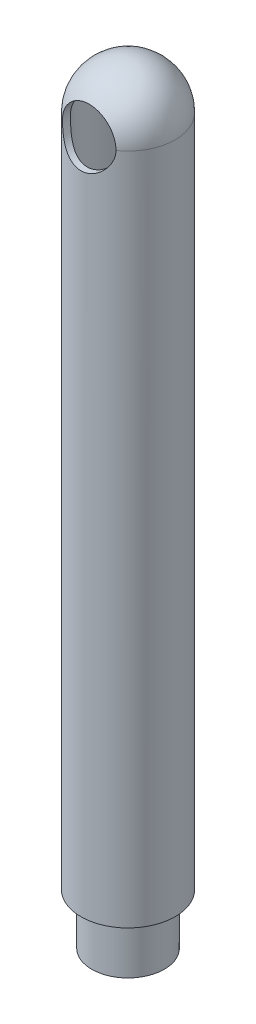
ISO-10303-21;
HEADER;
FILE_DESCRIPTION(('STEP AP214'),'2;1');
FILE_NAME('part.step','',(''),(''),'','','');
FILE_SCHEMA(('AUTOMOTIVE_DESIGN { 1 0 10303 214 1 1 1 1 }'));
ENDSEC;
DATA;
#1=APPLICATION_CONTEXT('core data for automotive mechanical design processes');
#2=APPLICATION_PROTOCOL_DEFINITION('international standard','automotive_design',2000,#1);
#3=PRODUCT_CONTEXT('',#1,'mechanical');
#4=PRODUCT('Part','Part','',(#3));
#5=PRODUCT_RELATED_PRODUCT_CATEGORY('part','',(#4));
#6=PRODUCT_DEFINITION_FORMATION('','',#4);
#7=PRODUCT_DEFINITION_CONTEXT('part definition',#1,'design');
#8=PRODUCT_DEFINITION('design','',#6,#7);
#9=PRODUCT_DEFINITION_SHAPE('','',#8);
#10=(LENGTH_UNIT() NAMED_UNIT(*) SI_UNIT(.MILLI.,.METRE.));
#11=(NAMED_UNIT(*) PLANE_ANGLE_UNIT() SI_UNIT($,.RADIAN.));
#12=(NAMED_UNIT(*) SI_UNIT($,.STERADIAN.) SOLID_ANGLE_UNIT());
#13=UNCERTAINTY_MEASURE_WITH_UNIT(LENGTH_MEASURE(1.E-05),#10,'distance_accuracy_value','');
#14=(GEOMETRIC_REPRESENTATION_CONTEXT(3) GLOBAL_UNCERTAINTY_ASSIGNED_CONTEXT((#13)) GLOBAL_UNIT_ASSIGNED_CONTEXT((#10,
#11,#12)) REPRESENTATION_CONTEXT('',''));
#15=CARTESIAN_POINT('',(0.,0.,0.));
#16=DIRECTION('',(0.,0.,1.));
#17=DIRECTION('',(1.,0.,0.));
#18=AXIS2_PLACEMENT_3D('',#15,#16,#17);
#19=CARTESIAN_POINT('',(0.,0.,0.));
#20=DIRECTION('',(0.,-1.,0.));
#21=DIRECTION('',(0.,0.,-1.));
#22=AXIS2_PLACEMENT_3D('',#19,#20,#21);
#23=CYLINDRICAL_SURFACE('',#22,37.);
#24=CARTESIAN_POINT('',(21.,568.,-30.4630924234556));
#25=CARTESIAN_POINT('',(21.0000073262817,567.731189787036,-30.4630792801586));
#26=CARTESIAN_POINT('',(20.9948387992314,567.462385228528,-30.4666501375205));
#27=CARTESIAN_POINT('',(20.9742055145974,566.925374282696,-30.4808626862339));
#28=CARTESIAN_POINT('',(20.9587413689901,566.657167860769,-30.4915039573165));
#29=CARTESIAN_POINT('',(20.9175892458381,566.122128137417,-30.5197485645538));
#30=CARTESIAN_POINT('',(20.8919096897981,565.855293887867,-30.5373461658891));
#31=CARTESIAN_POINT('',(20.8304403165183,565.323346350503,-30.5793087651143));
#32=CARTESIAN_POINT('',(20.7946504035362,565.058233079011,-30.6036738270903));
#33=CARTESIAN_POINT('',(20.6728984187858,564.270076191436,-30.6861697671083));
#34=CARTESIAN_POINT('',(20.57224222865,563.750206175432,-30.7539195489469));
#35=CARTESIAN_POINT('',(20.3330008256143,562.722932287711,-30.9126118163972));
#36=CARTESIAN_POINT('',(20.194409237282,562.215530527046,-31.00355820026));
#37=CARTESIAN_POINT('',(19.8814897424874,561.217754555845,-31.2051415253092));
#38=CARTESIAN_POINT('',(19.7072764882901,560.727331476066,-31.3157151471102));
#39=CARTESIAN_POINT('',(19.3246080672965,559.764219599621,-31.5532914305636));
#40=CARTESIAN_POINT('',(19.1161537036553,559.291530387311,-31.6802937068528));
#41=CARTESIAN_POINT('',(18.6662684755912,558.364844691443,-31.9474406108234));
#42=CARTESIAN_POINT('',(18.4247763649775,557.910885012706,-32.0876094921856));
#43=CARTESIAN_POINT('',(17.9106649403664,557.024079854279,-32.3773864757737));
#44=CARTESIAN_POINT('',(17.6380423976134,556.591236571377,-32.5269955563877));
#45=CARTESIAN_POINT('',(17.0322001145425,555.702703312134,-32.8486535677944));
#46=CARTESIAN_POINT('',(16.6956168924399,555.249551600986,-33.0213869364217));
#47=CARTESIAN_POINT('',(15.9877358756512,554.372456590684,-33.3698658898318));
#48=CARTESIAN_POINT('',(15.6164362296817,553.948514851274,-33.5456116348435));
#49=CARTESIAN_POINT('',(14.8406016882713,553.13144294136,-33.8959841445135));
#50=CARTESIAN_POINT('',(14.4360571207653,552.738321803069,-34.0706105674806));
#51=CARTESIAN_POINT('',(13.5954028480295,551.98489364322,-34.4146962655983));
#52=CARTESIAN_POINT('',(13.1592917932623,551.624588026088,-34.5841553193917));
#53=CARTESIAN_POINT('',(12.2149662427591,550.906772510843,-34.9295054327883));
#54=CARTESIAN_POINT('',(11.7038230929026,550.552677050077,-35.1045152955826));
#55=CARTESIAN_POINT('',(10.6483645388979,549.8892056197,-35.4389444159263));
#56=CARTESIAN_POINT('',(10.104046516294,549.579833186542,-35.5983624402359));
#57=CARTESIAN_POINT('',(8.9857937754531,549.009232611914,-35.8969380893811));
#58=CARTESIAN_POINT('',(8.41187673544039,548.747976149483,-36.0361076222407));
#59=CARTESIAN_POINT('',(7.23818631111357,548.276704394683,-36.2900669392296));
#60=CARTESIAN_POINT('',(6.63841665456105,548.066681743657,-36.4048602241858));
#61=CARTESIAN_POINT('',(5.47135075111755,547.71694561731,-36.597581122399));
#62=CARTESIAN_POINT('',(4.90580182372328,547.572689577531,-36.677854844609));
#63=CARTESIAN_POINT('',(3.7616967872567,547.331392524959,-36.8127871980505));
#64=CARTESIAN_POINT('',(3.18314137290279,547.234348996633,-36.8674471940032));
#65=CARTESIAN_POINT('',(2.01841377857129,547.088992978192,-36.9495144350707));
#66=CARTESIAN_POINT('',(1.43224700389415,547.040647636648,-36.9769400521156));
#67=CARTESIAN_POINT('',(0.25730311423253,546.993349213026,-37.0037697337288));
#68=CARTESIAN_POINT('',(-0.331473770466394,546.994391856963,-37.0031762230435));
#69=CARTESIAN_POINT('',(-1.44061185769002,547.042958368936,-36.9756312419025));
#70=CARTESIAN_POINT('',(-1.96128382139083,547.085288278257,-36.9516251211814));
#71=CARTESIAN_POINT('',(-2.99657110881481,547.208361192122,-36.8821048028966));
#72=CARTESIAN_POINT('',(-3.51118698314675,547.289100676451,-36.8365925763571));
#73=CARTESIAN_POINT('',(-4.53086126258383,547.488023877407,-36.7251193400592));
#74=CARTESIAN_POINT('',(-5.03591945263197,547.606208435524,-36.6591578707523));
#75=CARTESIAN_POINT('',(-6.03328875863972,547.878700183883,-36.5082708771462));
#76=CARTESIAN_POINT('',(-6.52559936712548,548.033008809755,-36.4233445991601));
#77=CARTESIAN_POINT('',(-7.49908773107979,548.377748025534,-36.2355032633964));
#78=CARTESIAN_POINT('',(-7.98012218348488,548.568496575861,-36.1324305390903));
#79=CARTESIAN_POINT('',(-8.9238646826361,548.98341858198,-35.9109954485033));
#80=CARTESIAN_POINT('',(-9.386572841195,549.207591833801,-35.7926331755261));
#81=CARTESIAN_POINT('',(-10.2916859365514,549.687608860885,-35.542954937893));
#82=CARTESIAN_POINT('',(-10.734087584937,549.943457741032,-35.4116368859617));
#83=CARTESIAN_POINT('',(-11.5968272743117,550.48506152568,-35.1385597229849));
#84=CARTESIAN_POINT('',(-12.0171631762838,550.770819321493,-34.9967996028916));
#85=CARTESIAN_POINT('',(-12.8800999131459,551.404197106812,-34.6891289968841));
#86=CARTESIAN_POINT('',(-13.319919062455,551.75516103625,-34.5222921909058));
#87=CARTESIAN_POINT('',(-14.1687439274886,552.489943167464,-34.1826814793623));
#88=CARTESIAN_POINT('',(-14.5777475745786,552.873763571196,-34.0099071763464));
#89=CARTESIAN_POINT('',(-15.3638750751635,553.672896489012,-33.6620902331708));
#90=CARTESIAN_POINT('',(-15.7409568816733,554.088249212754,-33.4870449410201));
#91=CARTESIAN_POINT('',(-16.4610901684504,554.948290961332,-33.1389872520046));
#92=CARTESIAN_POINT('',(-16.8041404078302,555.392981054908,-32.9659749294702));
#93=CARTESIAN_POINT('',(-17.4865452454603,556.355175145804,-32.6095553743422));
#94=CARTESIAN_POINT('',(-17.8222207618946,556.875539564525,-32.4267984344191));
#95=CARTESIAN_POINT('',(-18.4480855648418,557.947471061146,-32.0748672727312));
#96=CARTESIAN_POINT('',(-18.7382679531771,558.499042853835,-31.9056951127363));
#97=CARTESIAN_POINT('',(-19.2695439844222,559.629017273637,-31.5876606985385));
#98=CARTESIAN_POINT('',(-19.5107722206612,560.207340815678,-31.4387431395766));
#99=CARTESIAN_POINT('',(-19.9420266180382,561.388608918112,-31.1669807495764));
#100=CARTESIAN_POINT('',(-20.1320732349065,561.991543530929,-31.0441255064065));
#101=CARTESIAN_POINT('',(-20.410527615124,563.03888707221,-30.8614542643029));
#102=CARTESIAN_POINT('',(-20.5124191216094,563.478373609711,-30.7936971856277));
#103=CARTESIAN_POINT('',(-20.68797974885,564.36520971563,-30.6760281519441));
#104=CARTESIAN_POINT('',(-20.7616572270046,564.812556914481,-30.6261109128122));
#105=CARTESIAN_POINT('',(-20.8802981419357,565.71500696322,-30.5453493737808));
#106=CARTESIAN_POINT('',(-20.9251225969,566.170136669308,-30.5145974131522));
#107=CARTESIAN_POINT('',(-20.9700148561181,566.855039339858,-30.4837458401841));
#108=CARTESIAN_POINT('',(-20.9812548926054,567.083805043495,-30.4760080073256));
#109=CARTESIAN_POINT('',(-20.9962483577068,567.541705643966,-30.4656790457651));
#110=CARTESIAN_POINT('',(-21.0000015200158,567.770840553642,-30.4630881001358));
#111=CARTESIAN_POINT('',(-21.,568.,-30.4630924234556));
#112=B_SPLINE_CURVE_WITH_KNOTS('',3,(#24,#25,#26,#27,#28,#29,#30,#31,#32,#33,#34,#35,#36,#37,
#38,#39,#40,#41,#42,#43,#44,#45,#46,#47,#48,#49,#50,#51,#52,#53,#54,#55,#56,#57,#58,#59,#60,#61,
#62,#63,#64,#65,#66,#67,#68,#69,#70,#71,#72,#73,#74,#75,#76,#77,#78,#79,#80,#81,#82,#83,#84,#85,
#86,#87,#88,#89,#90,#91,#92,#93,#94,#95,#96,#97,#98,#99,#100,#101,#102,#103,#104,#105,#106,#107,
#108,#109,#110,#111),.UNSPECIFIED.,.F.,.F.,(4,2,2,2,2,2,2,2,2,2,2,2,2,2,2,2,2,2,2,2,2,2,2,2,2,2,
2,2,2,2,2,2,2,2,2,2,2,2,2,2,2,2,2,4),(0.,0.806347326984684,1.61264672857906,2.418282796196,
3.22392649323257,4.82317636415643,6.42269517060289,8.01714457517711,9.61155658588832,
11.208965453795,12.8065401509339,14.5756774360223,16.3449091157491,18.1146573591833,
19.8844813080264,21.8198633708128,23.7553983894601,25.6897904895691,27.62390459124,
29.3888702881488,31.1537419354884,32.9174222147473,34.680949867203,36.2479068613803,
37.8147202725472,39.3815688966908,40.9484798005702,42.5297450477564,44.1110006458084,
45.6925114135557,47.2741752083181,49.033043957547,50.7920306740511,52.5532993764,
54.3146322760145,56.2491275598298,58.1839158903698,60.1133104598841,62.0419327610579,
63.4093634765838,64.7763888256382,66.1499506600343,66.837310691859,67.524695172365),.UNSPECIFIED.);
#113=CARTESIAN_POINT('',(21.,568.,-30.4630924234556));
#114=VERTEX_POINT('',#113);
#115=CARTESIAN_POINT('',(-21.,568.,-30.4630924234556));
#116=VERTEX_POINT('',#115);
#117=EDGE_CURVE('E54',#114,#116,#112,.T.);
#118=ORIENTED_EDGE('',*,*,#117,.F.);
#119=CARTESIAN_POINT('',(0.,568.,0.));
#120=DIRECTION('',(0.,-1.,0.));
#121=DIRECTION('',(0.,0.,-1.));
#122=AXIS2_PLACEMENT_3D('',#119,#120,#121);
#123=CIRCLE('',#122,37.);
#124=CARTESIAN_POINT('',(21.,568.,30.4630924234556));
#125=VERTEX_POINT('',#124);
#126=EDGE_CURVE('E87',#114,#125,#123,.T.);
#127=ORIENTED_EDGE('',*,*,#126,.T.);
#128=CARTESIAN_POINT('',(-21.,568.,30.4630924234556));
#129=CARTESIAN_POINT('',(-21.0000073262817,567.731189787036,30.4630792801586));
#130=CARTESIAN_POINT('',(-20.9948387992314,567.462385228528,30.4666501375205));
#131=CARTESIAN_POINT('',(-20.9742055145974,566.925374282696,30.4808626862339));
#132=CARTESIAN_POINT('',(-20.9587413689901,566.657167860769,30.4915039573165));
#133=CARTESIAN_POINT('',(-20.9175892458381,566.122128137417,30.5197485645538));
#134=CARTESIAN_POINT('',(-20.8919096897981,565.855293887867,30.5373461658891));
#135=CARTESIAN_POINT('',(-20.8304403165183,565.323346350503,30.5793087651143));
#136=CARTESIAN_POINT('',(-20.7946504035362,565.058233079011,30.6036738270903));
#137=CARTESIAN_POINT('',(-20.6728984187858,564.270076191436,30.6861697671083));
#138=CARTESIAN_POINT('',(-20.57224222865,563.750206175432,30.7539195489469));
#139=CARTESIAN_POINT('',(-20.3330008256143,562.722932287711,30.9126118163972));
#140=CARTESIAN_POINT('',(-20.194409237282,562.215530527046,31.00355820026));
#141=CARTESIAN_POINT('',(-19.8814897424874,561.217754555845,31.2051415253092));
#142=CARTESIAN_POINT('',(-19.7072764882901,560.727331476066,31.3157151471102));
#143=CARTESIAN_POINT('',(-19.3246080672965,559.764219599621,31.5532914305636));
#144=CARTESIAN_POINT('',(-19.1161537036553,559.291530387311,31.6802937068528));
#145=CARTESIAN_POINT('',(-18.6662684755912,558.364844691443,31.9474406108234));
#146=CARTESIAN_POINT('',(-18.4247763649775,557.910885012706,32.0876094921856));
#147=CARTESIAN_POINT('',(-17.9106649403664,557.024079854279,32.3773864757737));
#148=CARTESIAN_POINT('',(-17.6380423976134,556.591236571377,32.5269955563877));
#149=CARTESIAN_POINT('',(-17.0322001145425,555.702703312134,32.8486535677944));
#150=CARTESIAN_POINT('',(-16.6956168924399,555.249551600986,33.0213869364217));
#151=CARTESIAN_POINT('',(-15.9877358756512,554.372456590684,33.3698658898318));
#152=CARTESIAN_POINT('',(-15.6164362296817,553.948514851274,33.5456116348435));
#153=CARTESIAN_POINT('',(-14.8406016882713,553.13144294136,33.8959841445135));
#154=CARTESIAN_POINT('',(-14.4360571207653,552.738321803069,34.0706105674806));
#155=CARTESIAN_POINT('',(-13.5954028480295,551.98489364322,34.4146962655983));
#156=CARTESIAN_POINT('',(-13.1592917932623,551.624588026088,34.5841553193917));
#157=CARTESIAN_POINT('',(-12.2149662427591,550.906772510843,34.9295054327883));
#158=CARTESIAN_POINT('',(-11.7038230929026,550.552677050077,35.1045152955826));
#159=CARTESIAN_POINT('',(-10.6483645388979,549.8892056197,35.4389444159263));
#160=CARTESIAN_POINT('',(-10.104046516294,549.579833186542,35.5983624402359));
#161=CARTESIAN_POINT('',(-8.9857937754531,549.009232611914,35.8969380893811));
#162=CARTESIAN_POINT('',(-8.41187673544039,548.747976149483,36.0361076222407));
#163=CARTESIAN_POINT('',(-7.23818631111357,548.276704394683,36.2900669392296));
#164=CARTESIAN_POINT('',(-6.63841665456105,548.066681743657,36.4048602241858));
#165=CARTESIAN_POINT('',(-5.47135075111755,547.71694561731,36.597581122399));
#166=CARTESIAN_POINT('',(-4.90580182372328,547.572689577531,36.677854844609));
#167=CARTESIAN_POINT('',(-3.7616967872567,547.331392524959,36.8127871980505));
#168=CARTESIAN_POINT('',(-3.18314137290279,547.234348996633,36.8674471940032));
#169=CARTESIAN_POINT('',(-2.01841377857129,547.088992978192,36.9495144350707));
#170=CARTESIAN_POINT('',(-1.43224700389415,547.040647636648,36.9769400521156));
#171=CARTESIAN_POINT('',(-0.25730311423253,546.993349213026,37.0037697337288));
#172=CARTESIAN_POINT('',(0.331473770466394,546.994391856963,37.0031762230435));
#173=CARTESIAN_POINT('',(1.44061185769002,547.042958368936,36.9756312419025));
#174=CARTESIAN_POINT('',(1.96128382139083,547.085288278257,36.9516251211814));
#175=CARTESIAN_POINT('',(2.99657110881481,547.208361192122,36.8821048028966));
#176=CARTESIAN_POINT('',(3.51118698314675,547.289100676451,36.8365925763571));
#177=CARTESIAN_POINT('',(4.53086126258383,547.488023877407,36.7251193400592));
#178=CARTESIAN_POINT('',(5.03591945263197,547.606208435524,36.6591578707523));
#179=CARTESIAN_POINT('',(6.03328875863972,547.878700183883,36.5082708771462));
#180=CARTESIAN_POINT('',(6.52559936712548,548.033008809755,36.4233445991601));
#181=CARTESIAN_POINT('',(7.49908773107979,548.377748025534,36.2355032633964));
#182=CARTESIAN_POINT('',(7.98012218348488,548.568496575861,36.1324305390903));
#183=CARTESIAN_POINT('',(8.9238646826361,548.98341858198,35.9109954485033));
#184=CARTESIAN_POINT('',(9.386572841195,549.207591833801,35.7926331755261));
#185=CARTESIAN_POINT('',(10.2916859365514,549.687608860885,35.542954937893));
#186=CARTESIAN_POINT('',(10.734087584937,549.943457741032,35.4116368859617));
#187=CARTESIAN_POINT('',(11.5968272743117,550.48506152568,35.1385597229849));
#188=CARTESIAN_POINT('',(12.0171631762838,550.770819321493,34.9967996028916));
#189=CARTESIAN_POINT('',(12.8800999131459,551.404197106812,34.6891289968841));
#190=CARTESIAN_POINT('',(13.319919062455,551.75516103625,34.5222921909058));
#191=CARTESIAN_POINT('',(14.1687439274886,552.489943167464,34.1826814793623));
#192=CARTESIAN_POINT('',(14.5777475745786,552.873763571196,34.0099071763464));
#193=CARTESIAN_POINT('',(15.3638750751635,553.672896489012,33.6620902331708));
#194=CARTESIAN_POINT('',(15.7409568816733,554.088249212754,33.4870449410201));
#195=CARTESIAN_POINT('',(16.4610901684504,554.948290961332,33.1389872520046));
#196=CARTESIAN_POINT('',(16.8041404078302,555.392981054908,32.9659749294702));
#197=CARTESIAN_POINT('',(17.4865452454603,556.355175145804,32.6095553743422));
#198=CARTESIAN_POINT('',(17.8222207618946,556.875539564525,32.4267984344191));
#199=CARTESIAN_POINT('',(18.4480855648418,557.947471061146,32.0748672727312));
#200=CARTESIAN_POINT('',(18.7382679531771,558.499042853835,31.9056951127363));
#201=CARTESIAN_POINT('',(19.2695439844222,559.629017273637,31.5876606985385));
#202=CARTESIAN_POINT('',(19.5107722206612,560.207340815678,31.4387431395766));
#203=CARTESIAN_POINT('',(19.9420266180382,561.388608918112,31.1669807495764));
#204=CARTESIAN_POINT('',(20.1320732349065,561.991543530929,31.0441255064065));
#205=CARTESIAN_POINT('',(20.410527615124,563.03888707221,30.8614542643029));
#206=CARTESIAN_POINT('',(20.5124191216094,563.478373609711,30.7936971856277));
#207=CARTESIAN_POINT('',(20.68797974885,564.36520971563,30.6760281519441));
#208=CARTESIAN_POINT('',(20.7616572270046,564.812556914481,30.6261109128122));
#209=CARTESIAN_POINT('',(20.8802981419357,565.71500696322,30.5453493737808));
#210=CARTESIAN_POINT('',(20.9251225969,566.170136669308,30.5145974131522));
#211=CARTESIAN_POINT('',(20.9700148561181,566.855039339858,30.4837458401841));
#212=CARTESIAN_POINT('',(20.9812548926054,567.083805043495,30.4760080073256));
#213=CARTESIAN_POINT('',(20.9962483577068,567.541705643966,30.4656790457651));
#214=CARTESIAN_POINT('',(21.0000015200158,567.770840553642,30.4630881001358));
#215=CARTESIAN_POINT('',(21.,568.,30.4630924234556));
#216=B_SPLINE_CURVE_WITH_KNOTS('',3,(#128,#129,#130,#131,#132,#133,#134,#135,#136,#137,#138,
#139,#140,#141,#142,#143,#144,#145,#146,#147,#148,#149,#150,#151,#152,#153,#154,#155,#156,#157,
#158,#159,#160,#161,#162,#163,#164,#165,#166,#167,#168,#169,#170,#171,#172,#173,#174,#175,#176,
#177,#178,#179,#180,#181,#182,#183,#184,#185,#186,#187,#188,#189,#190,#191,#192,#193,#194,#195,
#196,#197,#198,#199,#200,#201,#202,#203,#204,#205,#206,#207,#208,#209,#210,#211,#212,#213,#214,
#215),.UNSPECIFIED.,.F.,.F.,(4,2,2,2,2,2,2,2,2,2,2,2,2,2,2,2,2,2,2,2,2,2,2,2,2,2,2,2,2,2,2,2,2,
2,2,2,2,2,2,2,2,2,2,4),(0.,0.806347326984684,1.61264672857906,2.418282796196,3.22392649323257,
4.82317636415643,6.42269517060289,8.01714457517711,9.61155658588832,11.208965453795,
12.8065401509339,14.5756774360223,16.3449091157491,18.1146573591833,19.8844813080264,
21.8198633708128,23.7553983894601,25.6897904895691,27.62390459124,29.3888702881488,
31.1537419354884,32.9174222147473,34.680949867203,36.2479068613803,37.8147202725472,
39.3815688966908,40.9484798005702,42.5297450477564,44.1110006458084,45.6925114135557,
47.2741752083181,49.033043957547,50.7920306740511,52.5532993764,54.3146322760145,
56.2491275598298,58.1839158903698,60.1133104598841,62.0419327610579,63.4093634765838,
64.7763888256382,66.1499506600343,66.837310691859,67.524695172365),.UNSPECIFIED.);
#217=CARTESIAN_POINT('',(-21.,568.,30.4630924234556));
#218=VERTEX_POINT('',#217);
#219=EDGE_CURVE('E61',#218,#125,#216,.T.);
#220=ORIENTED_EDGE('',*,*,#219,.F.);
#221=EDGE_CURVE('E100',#218,#116,#123,.T.);
#222=ORIENTED_EDGE('',*,*,#221,.T.);
#223=EDGE_LOOP('',(#118,#127,#220,#222));
#224=FACE_BOUND('',#223,.T.);
#225=CARTESIAN_POINT('',(0.,40.,0.));
#226=DIRECTION('',(0.,-1.,0.));
#227=DIRECTION('',(0.,0.,-1.));
#228=AXIS2_PLACEMENT_3D('',#225,#226,#227);
#229=CIRCLE('',#228,37.);
#230=CARTESIAN_POINT('',(0.,40.,-37.));
#231=VERTEX_POINT('',#230);
#232=EDGE_CURVE('E136',#231,#231,#229,.T.);
#233=ORIENTED_EDGE('',*,*,#232,.F.);
#234=EDGE_LOOP('',(#233));
#235=FACE_BOUND('',#234,.T.);
#236=ADVANCED_FACE('F35',(#224,#235),#23,.T.);
#237=CARTESIAN_POINT('',(0.,568.,0.));
#238=DIRECTION('',(0.,-1.,0.));
#239=DIRECTION('',(1.,0.,0.));
#240=AXIS2_PLACEMENT_3D('',#237,#238,#239);
#241=SPHERICAL_SURFACE('',#240,37.);
#242=CARTESIAN_POINT('',(0.,568.,30.4630924234556));
#243=DIRECTION('',(0.,0.,-1.));
#244=DIRECTION('',(-1.,0.,0.));
#245=AXIS2_PLACEMENT_3D('',#242,#243,#244);
#246=CIRCLE('',#245,21.);
#247=EDGE_CURVE('E129',#125,#218,#246,.F.);
#248=ORIENTED_EDGE('',*,*,#247,.F.);
#249=ORIENTED_EDGE('',*,*,#126,.F.);
#250=CARTESIAN_POINT('',(0.,568.,-30.4630924234556));
#251=DIRECTION('',(0.,0.,1.));
#252=DIRECTION('',(1.,0.,0.));
#253=AXIS2_PLACEMENT_3D('',#250,#251,#252);
#254=CIRCLE('',#253,21.);
#255=EDGE_CURVE('E130',#116,#114,#254,.F.);
#256=ORIENTED_EDGE('',*,*,#255,.F.);
#257=ORIENTED_EDGE('',*,*,#221,.F.);
#258=EDGE_LOOP('',(#248,#249,#256,#257));
#259=FACE_BOUND('',#258,.T.);
#260=ADVANCED_FACE('F172',(#259),#241,.T.);
#261=CARTESIAN_POINT('',(0.,568.,0.));
#262=DIRECTION('',(0.,-1.,0.));
#263=DIRECTION('',(1.,0.,0.));
#264=AXIS2_PLACEMENT_3D('',#261,#262,#263);
#265=SPHERICAL_SURFACE('',#264,32.);
#266=CARTESIAN_POINT('',(0.,568.,0.));
#267=DIRECTION('',(0.,-1.,0.));
#268=DIRECTION('',(0.,0.,-1.));
#269=AXIS2_PLACEMENT_3D('',#266,#267,#268);
#270=CIRCLE('',#269,32.);
#271=CARTESIAN_POINT('',(21.,568.,-24.1453929352993));
#272=VERTEX_POINT('',#271);
#273=CARTESIAN_POINT('',(21.,568.,24.1453929352993));
#274=VERTEX_POINT('',#273);
#275=EDGE_CURVE('E93',#272,#274,#270,.T.);
#276=ORIENTED_EDGE('',*,*,#275,.T.);
#277=CARTESIAN_POINT('',(0.,568.,24.1453929352993));
#278=DIRECTION('',(0.,0.,-1.));
#279=DIRECTION('',(-1.,0.,0.));
#280=AXIS2_PLACEMENT_3D('',#277,#278,#279);
#281=CIRCLE('',#280,21.);
#282=CARTESIAN_POINT('',(-21.,568.,24.1453929352993));
#283=VERTEX_POINT('',#282);
#284=EDGE_CURVE('E82',#274,#283,#281,.F.);
#285=ORIENTED_EDGE('',*,*,#284,.T.);
#286=CARTESIAN_POINT('',(-21.,568.,-24.1453929352993));
#287=VERTEX_POINT('',#286);
#288=EDGE_CURVE('E92',#283,#287,#270,.T.);
#289=ORIENTED_EDGE('',*,*,#288,.T.);
#290=CARTESIAN_POINT('',(0.,568.,-24.1453929352993));
#291=DIRECTION('',(0.,0.,1.));
#292=DIRECTION('',(1.,0.,0.));
#293=AXIS2_PLACEMENT_3D('',#290,#291,#292);
#294=CIRCLE('',#293,21.);
#295=EDGE_CURVE('E94',#287,#272,#294,.F.);
#296=ORIENTED_EDGE('',*,*,#295,.T.);
#297=EDGE_LOOP('',(#276,#285,#289,#296));
#298=FACE_BOUND('',#297,.T.);
#299=ADVANCED_FACE('F90',(#298),#265,.F.);
#300=CARTESIAN_POINT('',(0.,0.,0.));
#301=DIRECTION('',(0.,-1.,0.));
#302=DIRECTION('',(0.,0.,-1.));
#303=AXIS2_PLACEMENT_3D('',#300,#301,#302);
#304=CYLINDRICAL_SURFACE('',#303,32.);
#305=ORIENTED_EDGE('',*,*,#275,.F.);
#306=CARTESIAN_POINT('',(21.,568.,-24.1453929352993));
#307=CARTESIAN_POINT('',(21.0000088316979,567.740691037745,-24.1453747677393));
#308=CARTESIAN_POINT('',(20.9951972765071,567.481389489406,-24.1495697541191));
#309=CARTESIAN_POINT('',(20.9760002226579,566.963431901864,-24.1662514695807));
#310=CARTESIAN_POINT('',(20.9616156272982,566.704775804069,-24.1787374163389));
#311=CARTESIAN_POINT('',(20.9233631858055,566.189012695057,-24.2118458608544));
#312=CARTESIAN_POINT('',(20.8995071977962,565.931904153378,-24.2324581842149));
#313=CARTESIAN_POINT('',(20.8424448952335,565.41950084767,-24.2815545901595));
#314=CARTESIAN_POINT('',(20.8092384326426,565.164206112423,-24.3100387973717));
#315=CARTESIAN_POINT('',(20.6965472767031,564.406718763127,-24.4062037181729));
#316=CARTESIAN_POINT('',(20.603607348189,563.907831391839,-24.484935518309));
#317=CARTESIAN_POINT('',(20.383230871151,562.922703361117,-24.6686919441093));
#318=CARTESIAN_POINT('',(20.255784861515,562.436466210343,-24.7737237803018));
#319=CARTESIAN_POINT('',(19.9689375471104,561.481658382307,-25.0055059082618));
#320=CARTESIAN_POINT('',(19.8096982360572,561.013011902402,-25.1321456458305));
#321=CARTESIAN_POINT('',(19.4606530644217,560.092710379754,-25.4033815484109));
#322=CARTESIAN_POINT('',(19.2708486384692,559.641054540749,-25.5479768705714));
#323=CARTESIAN_POINT('',(18.8617380553961,558.754802944317,-25.8514962040515));
#324=CARTESIAN_POINT('',(18.6423570553214,558.320254202795,-26.0104562170485));
#325=CARTESIAN_POINT('',(18.1758299736148,557.470314733637,-26.3385753299218));
#326=CARTESIAN_POINT('',(17.9286803038417,557.054926491637,-26.5077357465364));
#327=CARTESIAN_POINT('',(17.3689891030261,556.183709731309,-26.8783737219659));
#328=CARTESIAN_POINT('',(17.052189822581,555.731064150408,-27.080913932151));
#329=CARTESIAN_POINT('',(16.3848883436248,554.853157212833,-27.4897906969876));
#330=CARTESIAN_POINT('',(16.0343839514128,554.427897641593,-27.6961274980328));
#331=CARTESIAN_POINT('',(15.3007230709074,553.605853630457,-28.1080933809534));
#332=CARTESIAN_POINT('',(14.9175553028036,553.209079115301,-28.3137221926224));
#333=CARTESIAN_POINT('',(14.1197500789186,552.445659373694,-28.7199073269651));
#334=CARTESIAN_POINT('',(13.705110563228,552.079016122691,-28.9204633164617));
#335=CARTESIAN_POINT('',(12.7858306114702,551.329022586695,-29.3395942097164));
#336=CARTESIAN_POINT('',(12.2766837938949,550.950408540102,-29.5568100432697));
#337=CARTESIAN_POINT('',(11.2210442373302,550.237858130975,-29.9734912945481));
#338=CARTESIAN_POINT('',(10.6745471763521,549.903926952195,-30.1729546518738));
#339=CARTESIAN_POINT('',(9.54741372521585,549.284766391966,-30.5483126085786));
#340=CARTESIAN_POINT('',(8.96680261086228,548.999501549402,-30.7242243487406));
#341=CARTESIAN_POINT('',(7.77493832830598,548.481488722636,-31.0472424497318));
#342=CARTESIAN_POINT('',(7.16369149881972,548.248729928985,-31.1943547386924));
#343=CARTESIAN_POINT('',(5.98400123885732,547.862132043321,-31.4406436445465));
#344=CARTESIAN_POINT('',(5.4182012054441,547.702441660689,-31.5433055403064));
#345=CARTESIAN_POINT('',(4.2707936170599,547.430415310377,-31.7190322235755));
#346=CARTESIAN_POINT('',(3.68918710819912,547.31807621696,-31.7920989646969));
#347=CARTESIAN_POINT('',(2.51606531754386,547.142847689961,-31.9063691696717));
#348=CARTESIAN_POINT('',(1.92456061227871,547.079908536209,-31.9476046704178));
#349=CARTESIAN_POINT('',(0.7369953107896,547.004508202843,-31.9970285689199));
#350=CARTESIAN_POINT('',(0.14093533637272,546.992040252855,-32.0052213991287));
#351=CARTESIAN_POINT('',(-0.961567175425778,547.01588625848,-31.9895769030265));
#352=CARTESIAN_POINT('',(-1.46824295696805,547.045267102885,-31.9702917121716));
#353=CARTESIAN_POINT('',(-2.47664429448446,547.140406828278,-31.9080134046263));
#354=CARTESIAN_POINT('',(-2.97837046012765,547.206161170547,-31.8650232458663));
#355=CARTESIAN_POINT('',(-3.97337860741308,547.373153357857,-31.756303248893));
#356=CARTESIAN_POINT('',(-4.46666012877828,547.474393130621,-31.6905721752968));
#357=CARTESIAN_POINT('',(-5.44157414604317,547.711064196975,-31.5377987791912));
#358=CARTESIAN_POINT('',(-5.92320613966883,547.84649696194,-31.4507555395927));
#359=CARTESIAN_POINT('',(-6.87094197136687,548.149631034804,-31.257376111375));
#360=CARTESIAN_POINT('',(-7.33707852742386,548.317258516305,-31.1510840937894));
#361=CARTESIAN_POINT('',(-8.25265227363694,548.683250544071,-30.9211342776345));
#362=CARTESIAN_POINT('',(-8.70208973558279,548.881614589803,-30.7974767618578));
#363=CARTESIAN_POINT('',(-9.58238329813768,549.307301771889,-30.5350435362887));
#364=CARTESIAN_POINT('',(-10.013240417395,549.534623317969,-30.3962686567649));
#365=CARTESIAN_POINT('',(-10.8549575374055,550.016531513341,-30.1059487747669));
#366=CARTESIAN_POINT('',(-11.2658152203511,550.271121311959,-29.9544022976783));
#367=CARTESIAN_POINT('',(-12.1182215278016,550.840618256934,-29.6206757017217));
#368=CARTESIAN_POINT('',(-12.5568486936885,551.159066537129,-29.4370706534333));
#369=CARTESIAN_POINT('',(-13.405734382334,551.826629289831,-29.0603162969956));
#370=CARTESIAN_POINT('',(-13.815990880721,552.175745946633,-28.8671663094557));
#371=CARTESIAN_POINT('',(-14.6077999759704,552.903579506988,-28.4746867647341));
#372=CARTESIAN_POINT('',(-14.9892960107424,553.282351898377,-28.2753460659012));
#373=CARTESIAN_POINT('',(-15.7217174653375,554.06745349012,-27.874753233038));
#374=CARTESIAN_POINT('',(-16.0726409813813,554.473784403772,-27.6735009808377));
#375=CARTESIAN_POINT('',(-16.7933004623472,555.375949408215,-27.2431023121571));
#376=CARTESIAN_POINT('',(-17.1579263128651,555.876052917794,-27.014313558808));
#377=CARTESIAN_POINT('',(-17.8434627758509,556.909667815585,-26.5664923504611));
#378=CARTESIAN_POINT('',(-18.1643662674574,557.443184625065,-26.3474614885868));
#379=CARTESIAN_POINT('',(-18.7588133044342,558.53985215885,-25.9275689968921));
#380=CARTESIAN_POINT('',(-19.0325378015737,559.102878345072,-25.7266394243189));
#381=CARTESIAN_POINT('',(-19.5310833971079,560.258398140622,-25.350235188121));
#382=CARTESIAN_POINT('',(-19.755915286797,560.850885211971,-25.1747549103287));
#383=CARTESIAN_POINT('',(-20.1230748987986,561.970519282704,-24.881888996788));
#384=CARTESIAN_POINT('',(-20.2727352808586,562.494016151921,-24.7597318742219));
#385=CARTESIAN_POINT('',(-20.5318473985312,563.556811381714,-24.5452986216119));
#386=CARTESIAN_POINT('',(-20.6413188295874,564.096101861999,-24.4530078575638));
#387=CARTESIAN_POINT('',(-20.7742853301892,564.916631418739,-24.3399343722897));
#388=CARTESIAN_POINT('',(-20.8135326807269,565.193678818179,-24.3063534449985));
#389=CARTESIAN_POINT('',(-20.881005990181,565.750092842199,-24.2484140350028));
#390=CARTESIAN_POINT('',(-20.9092322123994,566.029459411211,-24.2240553319738));
#391=CARTESIAN_POINT('',(-20.954519885941,566.590265390923,-24.1848928121052));
#392=CARTESIAN_POINT('',(-20.9715613336249,566.87170761005,-24.1701061151591));
#393=CARTESIAN_POINT('',(-20.9943083173097,567.43542958441,-24.150342811806));
#394=CARTESIAN_POINT('',(-21.0000123483377,567.717709445855,-24.1453675078022));
#395=CARTESIAN_POINT('',(-21.,568.,-24.1453929352993));
#396=B_SPLINE_CURVE_WITH_KNOTS('',3,(#306,#307,#308,#309,#310,#311,#312,#313,#314,#315,#316,
#317,#318,#319,#320,#321,#322,#323,#324,#325,#326,#327,#328,#329,#330,#331,#332,#333,#334,#335,
#336,#337,#338,#339,#340,#341,#342,#343,#344,#345,#346,#347,#348,#349,#350,#351,#352,#353,#354,
#355,#356,#357,#358,#359,#360,#361,#362,#363,#364,#365,#366,#367,#368,#369,#370,#371,#372,#373,
#374,#375,#376,#377,#378,#379,#380,#381,#382,#383,#384,#385,#386,#387,#388,#389,#390,#391,#392,
#393,#394,#395),.UNSPECIFIED.,.F.,.F.,(4,2,2,2,2,2,2,2,2,2,2,2,2,2,2,2,2,2,2,2,2,2,2,2,2,2,2,2,
2,2,2,2,2,2,2,2,2,2,2,2,2,2,2,2,4),(0.,0.777835610910433,1.55559783675135,2.33238936445943,
3.10919319107672,4.64751016167817,6.18624934637903,7.71733970660556,9.24835822323328,
10.7833263329428,12.3184930128536,14.0821507442628,15.8459233413221,17.6103075177792,
19.374807277617,21.384045952679,23.3935175220247,25.4015185613869,27.4091058345459,
29.196832167098,30.9844404704111,32.7702472619219,34.5558144914494,36.0776528197473,
37.5993012944336,39.1210324444981,40.6428290880737,42.1611768561701,43.6794999012305,
45.197739599682,46.7161548355704,48.4313200899512,50.1466076028914,51.8651849685514,
53.5838692752517,55.5610746202653,57.5386015997574,59.5083664463177,61.4776960954902,
63.1495324713511,64.8205484313182,65.6657008846276,66.5108331454719,67.3574728112178,
68.2042248557166),.UNSPECIFIED.);
#397=EDGE_CURVE('E11',#272,#287,#396,.T.);
#398=ORIENTED_EDGE('',*,*,#397,.T.);
#399=ORIENTED_EDGE('',*,*,#288,.F.);
#400=CARTESIAN_POINT('',(-21.,568.,24.1453929352993));
#401=CARTESIAN_POINT('',(-21.0000088316979,567.740691037745,24.1453747677393));
#402=CARTESIAN_POINT('',(-20.9951972765071,567.481389489406,24.1495697541191));
#403=CARTESIAN_POINT('',(-20.9760002226579,566.963431901864,24.1662514695807));
#404=CARTESIAN_POINT('',(-20.9616156272982,566.704775804069,24.1787374163389));
#405=CARTESIAN_POINT('',(-20.9233631858055,566.189012695057,24.2118458608544));
#406=CARTESIAN_POINT('',(-20.8995071977962,565.931904153378,24.2324581842149));
#407=CARTESIAN_POINT('',(-20.8424448952335,565.41950084767,24.2815545901595));
#408=CARTESIAN_POINT('',(-20.8092384326426,565.164206112423,24.3100387973717));
#409=CARTESIAN_POINT('',(-20.6965472767031,564.406718763127,24.4062037181729));
#410=CARTESIAN_POINT('',(-20.603607348189,563.907831391839,24.484935518309));
#411=CARTESIAN_POINT('',(-20.383230871151,562.922703361117,24.6686919441093));
#412=CARTESIAN_POINT('',(-20.255784861515,562.436466210343,24.7737237803018));
#413=CARTESIAN_POINT('',(-19.9689375471104,561.481658382307,25.0055059082618));
#414=CARTESIAN_POINT('',(-19.8096982360572,561.013011902402,25.1321456458305));
#415=CARTESIAN_POINT('',(-19.4606530644217,560.092710379754,25.4033815484109));
#416=CARTESIAN_POINT('',(-19.2708486384692,559.641054540749,25.5479768705714));
#417=CARTESIAN_POINT('',(-18.8617380553961,558.754802944317,25.8514962040515));
#418=CARTESIAN_POINT('',(-18.6423570553214,558.320254202795,26.0104562170485));
#419=CARTESIAN_POINT('',(-18.1758299736148,557.470314733637,26.3385753299218));
#420=CARTESIAN_POINT('',(-17.9286803038417,557.054926491637,26.5077357465364));
#421=CARTESIAN_POINT('',(-17.3689891030261,556.183709731309,26.8783737219659));
#422=CARTESIAN_POINT('',(-17.052189822581,555.731064150408,27.080913932151));
#423=CARTESIAN_POINT('',(-16.3848883436248,554.853157212833,27.4897906969876));
#424=CARTESIAN_POINT('',(-16.0343839514128,554.427897641593,27.6961274980328));
#425=CARTESIAN_POINT('',(-15.3007230709074,553.605853630457,28.1080933809534));
#426=CARTESIAN_POINT('',(-14.9175553028036,553.209079115301,28.3137221926224));
#427=CARTESIAN_POINT('',(-14.1197500789186,552.445659373694,28.7199073269651));
#428=CARTESIAN_POINT('',(-13.705110563228,552.079016122691,28.9204633164617));
#429=CARTESIAN_POINT('',(-12.7858306114702,551.329022586695,29.3395942097164));
#430=CARTESIAN_POINT('',(-12.2766837938949,550.950408540102,29.5568100432697));
#431=CARTESIAN_POINT('',(-11.2210442373302,550.237858130975,29.9734912945481));
#432=CARTESIAN_POINT('',(-10.6745471763521,549.903926952195,30.1729546518738));
#433=CARTESIAN_POINT('',(-9.54741372521585,549.284766391966,30.5483126085786));
#434=CARTESIAN_POINT('',(-8.96680261086228,548.999501549402,30.7242243487406));
#435=CARTESIAN_POINT('',(-7.77493832830598,548.481488722636,31.0472424497318));
#436=CARTESIAN_POINT('',(-7.16369149881972,548.248729928985,31.1943547386924));
#437=CARTESIAN_POINT('',(-5.98400123885732,547.862132043321,31.4406436445465));
#438=CARTESIAN_POINT('',(-5.4182012054441,547.702441660689,31.5433055403064));
#439=CARTESIAN_POINT('',(-4.2707936170599,547.430415310377,31.7190322235755));
#440=CARTESIAN_POINT('',(-3.68918710819912,547.31807621696,31.7920989646969));
#441=CARTESIAN_POINT('',(-2.51606531754386,547.142847689961,31.9063691696717));
#442=CARTESIAN_POINT('',(-1.92456061227871,547.079908536209,31.9476046704178));
#443=CARTESIAN_POINT('',(-0.7369953107896,547.004508202843,31.9970285689199));
#444=CARTESIAN_POINT('',(-0.14093533637272,546.992040252855,32.0052213991287));
#445=CARTESIAN_POINT('',(0.961567175425778,547.01588625848,31.9895769030265));
#446=CARTESIAN_POINT('',(1.46824295696805,547.045267102885,31.9702917121716));
#447=CARTESIAN_POINT('',(2.47664429448446,547.140406828278,31.9080134046263));
#448=CARTESIAN_POINT('',(2.97837046012765,547.206161170547,31.8650232458663));
#449=CARTESIAN_POINT('',(3.97337860741308,547.373153357857,31.756303248893));
#450=CARTESIAN_POINT('',(4.46666012877828,547.474393130621,31.6905721752968));
#451=CARTESIAN_POINT('',(5.44157414604317,547.711064196975,31.5377987791912));
#452=CARTESIAN_POINT('',(5.92320613966883,547.84649696194,31.4507555395927));
#453=CARTESIAN_POINT('',(6.87094197136687,548.149631034804,31.257376111375));
#454=CARTESIAN_POINT('',(7.33707852742386,548.317258516305,31.1510840937894));
#455=CARTESIAN_POINT('',(8.25265227363694,548.683250544071,30.9211342776345));
#456=CARTESIAN_POINT('',(8.70208973558279,548.881614589803,30.7974767618578));
#457=CARTESIAN_POINT('',(9.58238329813768,549.307301771889,30.5350435362887));
#458=CARTESIAN_POINT('',(10.013240417395,549.534623317969,30.3962686567649));
#459=CARTESIAN_POINT('',(10.8549575374055,550.016531513341,30.1059487747669));
#460=CARTESIAN_POINT('',(11.2658152203511,550.271121311959,29.9544022976783));
#461=CARTESIAN_POINT('',(12.1182215278016,550.840618256934,29.6206757017217));
#462=CARTESIAN_POINT('',(12.5568486936885,551.159066537129,29.4370706534333));
#463=CARTESIAN_POINT('',(13.405734382334,551.826629289831,29.0603162969956));
#464=CARTESIAN_POINT('',(13.815990880721,552.175745946633,28.8671663094557));
#465=CARTESIAN_POINT('',(14.6077999759704,552.903579506988,28.4746867647341));
#466=CARTESIAN_POINT('',(14.9892960107424,553.282351898377,28.2753460659012));
#467=CARTESIAN_POINT('',(15.7217174653375,554.06745349012,27.874753233038));
#468=CARTESIAN_POINT('',(16.0726409813813,554.473784403772,27.6735009808377));
#469=CARTESIAN_POINT('',(16.7933004623472,555.375949408215,27.2431023121571));
#470=CARTESIAN_POINT('',(17.1579263128651,555.876052917794,27.014313558808));
#471=CARTESIAN_POINT('',(17.8434627758509,556.909667815585,26.5664923504611));
#472=CARTESIAN_POINT('',(18.1643662674574,557.443184625065,26.3474614885868));
#473=CARTESIAN_POINT('',(18.7588133044342,558.53985215885,25.9275689968921));
#474=CARTESIAN_POINT('',(19.0325378015737,559.102878345072,25.7266394243189));
#475=CARTESIAN_POINT('',(19.5310833971079,560.258398140622,25.350235188121));
#476=CARTESIAN_POINT('',(19.755915286797,560.850885211971,25.1747549103287));
#477=CARTESIAN_POINT('',(20.1230748987986,561.970519282704,24.881888996788));
#478=CARTESIAN_POINT('',(20.2727352808586,562.494016151921,24.7597318742219));
#479=CARTESIAN_POINT('',(20.5318473985312,563.556811381714,24.5452986216119));
#480=CARTESIAN_POINT('',(20.6413188295874,564.096101861999,24.4530078575638));
#481=CARTESIAN_POINT('',(20.7742853301892,564.916631418739,24.3399343722897));
#482=CARTESIAN_POINT('',(20.8135326807269,565.193678818179,24.3063534449985));
#483=CARTESIAN_POINT('',(20.881005990181,565.750092842199,24.2484140350028));
#484=CARTESIAN_POINT('',(20.9092322123994,566.029459411211,24.2240553319738));
#485=CARTESIAN_POINT('',(20.954519885941,566.590265390923,24.1848928121052));
#486=CARTESIAN_POINT('',(20.9715613336249,566.87170761005,24.1701061151591));
#487=CARTESIAN_POINT('',(20.9943083173097,567.43542958441,24.150342811806));
#488=CARTESIAN_POINT('',(21.0000123483377,567.717709445855,24.1453675078022));
#489=CARTESIAN_POINT('',(21.,568.,24.1453929352993));
#490=B_SPLINE_CURVE_WITH_KNOTS('',3,(#400,#401,#402,#403,#404,#405,#406,#407,#408,#409,#410,
#411,#412,#413,#414,#415,#416,#417,#418,#419,#420,#421,#422,#423,#424,#425,#426,#427,#428,#429,
#430,#431,#432,#433,#434,#435,#436,#437,#438,#439,#440,#441,#442,#443,#444,#445,#446,#447,#448,
#449,#450,#451,#452,#453,#454,#455,#456,#457,#458,#459,#460,#461,#462,#463,#464,#465,#466,#467,
#468,#469,#470,#471,#472,#473,#474,#475,#476,#477,#478,#479,#480,#481,#482,#483,#484,#485,#486,
#487,#488,#489),.UNSPECIFIED.,.F.,.F.,(4,2,2,2,2,2,2,2,2,2,2,2,2,2,2,2,2,2,2,2,2,2,2,2,2,2,2,2,
2,2,2,2,2,2,2,2,2,2,2,2,2,2,2,2,4),(0.,0.777835610910433,1.55559783675135,2.33238936445943,
3.10919319107672,4.64751016167817,6.18624934637903,7.71733970660556,9.24835822323328,
10.7833263329428,12.3184930128536,14.0821507442628,15.8459233413221,17.6103075177792,
19.374807277617,21.384045952679,23.3935175220247,25.4015185613869,27.4091058345459,
29.196832167098,30.9844404704111,32.7702472619219,34.5558144914494,36.0776528197473,
37.5993012944336,39.1210324444981,40.6428290880737,42.1611768561701,43.6794999012305,
45.197739599682,46.7161548355704,48.4313200899512,50.1466076028914,51.8651849685514,
53.5838692752517,55.5610746202653,57.5386015997574,59.5083664463177,61.4776960954902,
63.1495324713511,64.8205484313182,65.6657008846276,66.5108331454719,67.3574728112178,
68.2042248557166),.UNSPECIFIED.);
#491=EDGE_CURVE('E48',#283,#274,#490,.T.);
#492=ORIENTED_EDGE('',*,*,#491,.T.);
#493=EDGE_LOOP('',(#305,#398,#399,#492));
#494=FACE_BOUND('',#493,.T.);
#495=CARTESIAN_POINT('',(0.,45.,0.));
#496=DIRECTION('',(0.,-1.,0.));
#497=DIRECTION('',(0.,0.,-1.));
#498=AXIS2_PLACEMENT_3D('',#495,#496,#497);
#499=CIRCLE('',#498,32.);
#500=CARTESIAN_POINT('',(0.,45.,-32.));
#501=VERTEX_POINT('',#500);
#502=EDGE_CURVE('E98',#501,#501,#499,.T.);
#503=ORIENTED_EDGE('',*,*,#502,.T.);
#504=EDGE_LOOP('',(#503));
#505=FACE_BOUND('',#504,.T.);
#506=ADVANCED_FACE('F96',(#494,#505),#304,.F.);
#507=CARTESIAN_POINT('',(0.,45.,0.));
#508=DIRECTION('',(0.,-1.,0.));
#509=DIRECTION('',(0.,0.,-1.));
#510=AXIS2_PLACEMENT_3D('',#507,#508,#509);
#511=PLANE('',#510);
#512=ORIENTED_EDGE('',*,*,#502,.F.);
#513=EDGE_LOOP('',(#512));
#514=FACE_BOUND('',#513,.T.);
#515=CARTESIAN_POINT('',(0.,45.,0.));
#516=DIRECTION('',(0.,-1.,0.));
#517=DIRECTION('',(0.,0.,-1.));
#518=AXIS2_PLACEMENT_3D('',#515,#516,#517);
#519=CIRCLE('',#518,23.5);
#520=CARTESIAN_POINT('',(0.,45.,-23.5));
#521=VERTEX_POINT('',#520);
#522=EDGE_CURVE('E102',#521,#521,#519,.T.);
#523=ORIENTED_EDGE('',*,*,#522,.T.);
#524=EDGE_LOOP('',(#523));
#525=FACE_BOUND('',#524,.T.);
#526=ADVANCED_FACE('F150',(#514,#525),#511,.F.);
#527=CARTESIAN_POINT('',(0.,0.,0.));
#528=DIRECTION('',(0.,-1.,0.));
#529=DIRECTION('',(0.,0.,-1.));
#530=AXIS2_PLACEMENT_3D('',#527,#528,#529);
#531=CYLINDRICAL_SURFACE('',#530,23.5);
#532=ORIENTED_EDGE('',*,*,#522,.F.);
#533=EDGE_LOOP('',(#532));
#534=FACE_BOUND('',#533,.T.);
#535=CARTESIAN_POINT('',(0.,0.,0.));
#536=DIRECTION('',(0.,-1.,0.));
#537=DIRECTION('',(0.,0.,-1.));
#538=AXIS2_PLACEMENT_3D('',#535,#536,#537);
#539=CIRCLE('',#538,23.5);
#540=CARTESIAN_POINT('',(0.,0.,-23.5));
#541=VERTEX_POINT('',#540);
#542=EDGE_CURVE('E145',#541,#541,#539,.T.);
#543=ORIENTED_EDGE('',*,*,#542,.T.);
#544=EDGE_LOOP('',(#543));
#545=FACE_BOUND('',#544,.T.);
#546=ADVANCED_FACE('F152',(#534,#545),#531,.F.);
#547=CARTESIAN_POINT('',(0.,0.,0.));
#548=DIRECTION('',(0.,1.,0.));
#549=DIRECTION('',(0.,0.,1.));
#550=AXIS2_PLACEMENT_3D('',#547,#548,#549);
#551=PLANE('',#550);
#552=ORIENTED_EDGE('',*,*,#542,.F.);
#553=EDGE_LOOP('',(#552));
#554=FACE_BOUND('',#553,.T.);
#555=CARTESIAN_POINT('',(0.,0.,0.));
#556=DIRECTION('',(0.,-1.,0.));
#557=DIRECTION('',(0.,0.,-1.));
#558=AXIS2_PLACEMENT_3D('',#555,#556,#557);
#559=CIRCLE('',#558,28.5);
#560=CARTESIAN_POINT('',(0.,0.,-28.5));
#561=VERTEX_POINT('',#560);
#562=EDGE_CURVE('E142',#561,#561,#559,.T.);
#563=ORIENTED_EDGE('',*,*,#562,.T.);
#564=EDGE_LOOP('',(#563));
#565=FACE_BOUND('',#564,.T.);
#566=ADVANCED_FACE('F155',(#554,#565),#551,.F.);
#567=CARTESIAN_POINT('',(0.,0.,0.));
#568=DIRECTION('',(0.,-1.,0.));
#569=DIRECTION('',(0.,0.,-1.));
#570=AXIS2_PLACEMENT_3D('',#567,#568,#569);
#571=CYLINDRICAL_SURFACE('',#570,28.5);
#572=CARTESIAN_POINT('',(0.,40.,0.));
#573=DIRECTION('',(0.,-1.,0.));
#574=DIRECTION('',(0.,0.,-1.));
#575=AXIS2_PLACEMENT_3D('',#572,#573,#574);
#576=CIRCLE('',#575,28.5);
#577=CARTESIAN_POINT('',(0.,40.,-28.5));
#578=VERTEX_POINT('',#577);
#579=EDGE_CURVE('E139',#578,#578,#576,.T.);
#580=ORIENTED_EDGE('',*,*,#579,.T.);
#581=EDGE_LOOP('',(#580));
#582=FACE_BOUND('',#581,.T.);
#583=ORIENTED_EDGE('',*,*,#562,.F.);
#584=EDGE_LOOP('',(#583));
#585=FACE_BOUND('',#584,.T.);
#586=ADVANCED_FACE('F161',(#582,#585),#571,.T.);
#587=CARTESIAN_POINT('',(0.,40.,0.));
#588=DIRECTION('',(0.,-1.,0.));
#589=DIRECTION('',(0.,0.,-1.));
#590=AXIS2_PLACEMENT_3D('',#587,#588,#589);
#591=PLANE('',#590);
#592=ORIENTED_EDGE('',*,*,#232,.T.);
#593=EDGE_LOOP('',(#592));
#594=FACE_BOUND('',#593,.T.);
#595=ORIENTED_EDGE('',*,*,#579,.F.);
#596=EDGE_LOOP('',(#595));
#597=FACE_BOUND('',#596,.T.);
#598=ADVANCED_FACE('F117',(#594,#597),#591,.T.);
#599=CARTESIAN_POINT('',(0.,568.,-37.));
#600=DIRECTION('',(0.,0.,1.));
#601=DIRECTION('',(1.,0.,0.));
#602=AXIS2_PLACEMENT_3D('',#599,#600,#601);
#603=CYLINDRICAL_SURFACE('',#602,21.);
#604=ORIENTED_EDGE('',*,*,#219,.T.);
#605=ORIENTED_EDGE('',*,*,#247,.T.);
#606=EDGE_LOOP('',(#604,#605));
#607=FACE_BOUND('',#606,.T.);
#608=ORIENTED_EDGE('',*,*,#491,.F.);
#609=ORIENTED_EDGE('',*,*,#284,.F.);
#610=EDGE_LOOP('',(#608,#609));
#611=FACE_BOUND('',#610,.T.);
#612=ADVANCED_FACE('F81',(#607,#611),#603,.F.);
#613=ORIENTED_EDGE('',*,*,#117,.T.);
#614=ORIENTED_EDGE('',*,*,#255,.T.);
#615=EDGE_LOOP('',(#613,#614));
#616=FACE_BOUND('',#615,.T.);
#617=ORIENTED_EDGE('',*,*,#397,.F.);
#618=ORIENTED_EDGE('',*,*,#295,.F.);
#619=EDGE_LOOP('',(#617,#618));
#620=FACE_BOUND('',#619,.T.);
#621=ADVANCED_FACE('F113',(#616,#620),#603,.F.);
#622=CLOSED_SHELL('',(#236,#260,#299,#506,#526,#546,#566,#586,#598,#612,#621));
#623=MANIFOLD_SOLID_BREP('B2',#622);
#624=ADVANCED_BREP_SHAPE_REPRESENTATION('',(#18,#623),#14);
#625=SHAPE_DEFINITION_REPRESENTATION(#9,#624);
ENDSEC;
END-ISO-10303-21;
